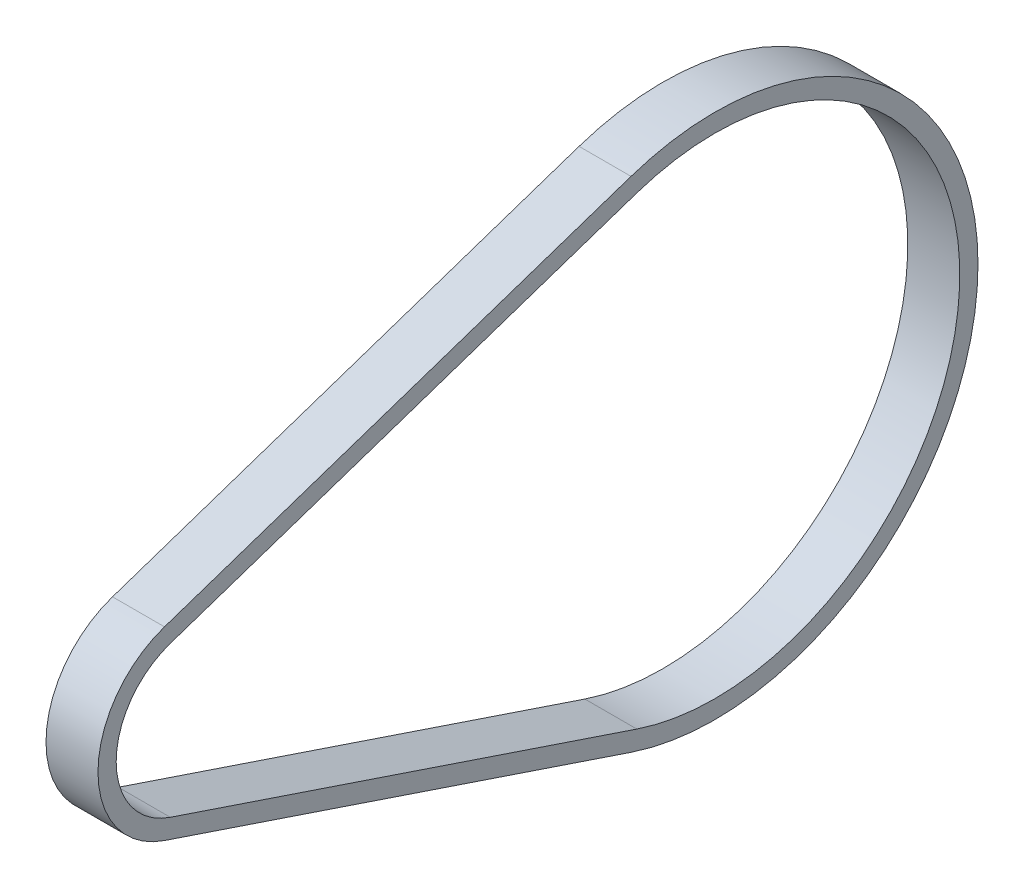
ISO-10303-21;
HEADER;
FILE_DESCRIPTION(('STEP AP214'),'2;1');
FILE_NAME('part.step','',(''),(''),'','','');
FILE_SCHEMA(('AUTOMOTIVE_DESIGN { 1 0 10303 214 1 1 1 1 }'));
ENDSEC;
DATA;
#1=APPLICATION_CONTEXT('core data for automotive mechanical design processes');
#2=APPLICATION_PROTOCOL_DEFINITION('international standard','automotive_design',2000,#1);
#3=PRODUCT_CONTEXT('',#1,'mechanical');
#4=PRODUCT('Part','Part','',(#3));
#5=PRODUCT_RELATED_PRODUCT_CATEGORY('part','',(#4));
#6=PRODUCT_DEFINITION_FORMATION('','',#4);
#7=PRODUCT_DEFINITION_CONTEXT('part definition',#1,'design');
#8=PRODUCT_DEFINITION('design','',#6,#7);
#9=PRODUCT_DEFINITION_SHAPE('','',#8);
#10=(LENGTH_UNIT() NAMED_UNIT(*) SI_UNIT(.MILLI.,.METRE.));
#11=(NAMED_UNIT(*) PLANE_ANGLE_UNIT() SI_UNIT($,.RADIAN.));
#12=(NAMED_UNIT(*) SI_UNIT($,.STERADIAN.) SOLID_ANGLE_UNIT());
#13=UNCERTAINTY_MEASURE_WITH_UNIT(LENGTH_MEASURE(1.E-05),#10,'distance_accuracy_value','');
#14=(GEOMETRIC_REPRESENTATION_CONTEXT(3) GLOBAL_UNCERTAINTY_ASSIGNED_CONTEXT((#13)) GLOBAL_UNIT_ASSIGNED_CONTEXT((#10,
#11,#12)) REPRESENTATION_CONTEXT('',''));
#15=CARTESIAN_POINT('',(0.,0.,0.));
#16=DIRECTION('',(0.,0.,1.));
#17=DIRECTION('',(1.,0.,0.));
#18=AXIS2_PLACEMENT_3D('',#15,#16,#17);
#19=CARTESIAN_POINT('',(6.021,39.066982169511,93.218905768999));
#20=DIRECTION('',(0.,-0.947862243379144,-0.318680353295048));
#21=DIRECTION('',(0.,0.318680353295048,-0.947862243379144));
#22=AXIS2_PLACEMENT_3D('',#19,#20,#21);
#23=PLANE('',#22);
#24=DIRECTION('',(1.,0.,0.));
#25=VECTOR('',#24,1.);
#26=CARTESIAN_POINT('',(6.021,57.1698175379885,39.3750024141588));
#27=LINE('',#26,#25);
#28=CARTESIAN_POINT('',(0.0209999999999844,57.1698175379887,39.3750024141591));
#29=VERTEX_POINT('',#28);
#30=CARTESIAN_POINT('',(6.021,57.1698175379887,39.3750024141591));
#31=VERTEX_POINT('',#30);
#32=EDGE_CURVE('E96',#29,#31,#27,.T.);
#33=ORIENTED_EDGE('',*,*,#32,.T.);
#34=DIRECTION('',(0.,-0.318680353294782,0.947862243379234));
#35=VECTOR('',#34,1.);
#36=CARTESIAN_POINT('',(6.021,57.169817537989,39.375002414159));
#37=LINE('',#36,#35);
#38=CARTESIAN_POINT('',(6.021,39.0669821695112,93.218905768999));
#39=VERTEX_POINT('',#38);
#40=EDGE_CURVE('E95',#31,#39,#37,.T.);
#41=ORIENTED_EDGE('',*,*,#40,.T.);
#42=DIRECTION('',(1.,0.,0.));
#43=VECTOR('',#42,1.);
#44=CARTESIAN_POINT('',(6.021,39.0669821695114,93.2189057689991));
#45=LINE('',#44,#43);
#46=CARTESIAN_POINT('',(0.0209999999999897,39.0669821695112,93.218905768999));
#47=VERTEX_POINT('',#46);
#48=EDGE_CURVE('E121',#39,#47,#45,.F.);
#49=ORIENTED_EDGE('',*,*,#48,.T.);
#50=DIRECTION('',(0.,-0.318680353294782,0.947862243379234));
#51=VECTOR('',#50,1.);
#52=CARTESIAN_POINT('',(0.020999999999987,57.169817537989,39.375002414159));
#53=LINE('',#52,#51);
#54=EDGE_CURVE('E132',#29,#47,#53,.T.);
#55=ORIENTED_EDGE('',*,*,#54,.F.);
#56=EDGE_LOOP('',(#33,#41,#49,#55));
#57=FACE_BOUND('',#56,.T.);
#58=ADVANCED_FACE('F15',(#57),#23,.T.);
#59=CARTESIAN_POINT('',(6.021,30.3767,90.297149774016));
#60=DIRECTION('',(1.,0.,0.));
#61=DIRECTION('',(0.,1.,0.));
#62=AXIS2_PLACEMENT_3D('',#59,#60,#61);
#63=CYLINDRICAL_SURFACE('',#62,9.168296585514);
#64=CARTESIAN_POINT('',(0.0209999999999906,30.3767,90.297149774016));
#65=DIRECTION('',(1.,0.,0.));
#66=DIRECTION('',(0.,1.,0.));
#67=AXIS2_PLACEMENT_3D('',#64,#65,#66);
#68=CIRCLE('',#67,9.168296585514);
#69=CARTESIAN_POINT('',(0.0209999999999916,21.6864178304965,93.2189057689964));
#70=VERTEX_POINT('',#69);
#71=EDGE_CURVE('E129',#47,#70,#68,.T.);
#72=ORIENTED_EDGE('',*,*,#71,.F.);
#73=ORIENTED_EDGE('',*,*,#48,.F.);
#74=CARTESIAN_POINT('',(6.021,30.3767,90.297149774016));
#75=DIRECTION('',(1.,0.,0.));
#76=DIRECTION('',(0.,1.,0.));
#77=AXIS2_PLACEMENT_3D('',#74,#75,#76);
#78=CIRCLE('',#77,9.168296585514);
#79=CARTESIAN_POINT('',(6.021,21.6864178304965,93.2189057689964));
#80=VERTEX_POINT('',#79);
#81=EDGE_CURVE('E108',#39,#80,#78,.T.);
#82=ORIENTED_EDGE('',*,*,#81,.T.);
#83=DIRECTION('',(1.,0.,0.));
#84=VECTOR('',#83,1.);
#85=CARTESIAN_POINT('',(6.021,21.6864178305042,93.2189057689939));
#86=LINE('',#85,#84);
#87=EDGE_CURVE('E117',#70,#80,#86,.T.);
#88=ORIENTED_EDGE('',*,*,#87,.F.);
#89=EDGE_LOOP('',(#72,#73,#82,#88));
#90=FACE_BOUND('',#89,.T.);
#91=ADVANCED_FACE('F139',(#90),#63,.F.);
#92=CARTESIAN_POINT('',(6.021,3.583582462011,39.375002414159));
#93=DIRECTION('',(0.,0.947862243379144,-0.318680353295048));
#94=DIRECTION('',(0.,0.318680353295048,0.947862243379144));
#95=AXIS2_PLACEMENT_3D('',#92,#93,#94);
#96=PLANE('',#95);
#97=ORIENTED_EDGE('',*,*,#87,.T.);
#98=DIRECTION('',(0.,-0.318680353294782,-0.947862243379234));
#99=VECTOR('',#98,1.);
#100=CARTESIAN_POINT('',(6.021,21.686417830489,93.218905768999));
#101=LINE('',#100,#99);
#102=CARTESIAN_POINT('',(6.02100000000001,3.58358246201129,39.3750024141591));
#103=VERTEX_POINT('',#102);
#104=EDGE_CURVE('E106',#80,#103,#101,.T.);
#105=ORIENTED_EDGE('',*,*,#104,.T.);
#106=DIRECTION('',(1.,0.,0.));
#107=VECTOR('',#106,1.);
#108=CARTESIAN_POINT('',(6.021,3.58358246201147,39.3750024141588));
#109=LINE('',#108,#107);
#110=CARTESIAN_POINT('',(0.02099999999999,3.58358246201129,39.3750024141591));
#111=VERTEX_POINT('',#110);
#112=EDGE_CURVE('E115',#103,#111,#109,.F.);
#113=ORIENTED_EDGE('',*,*,#112,.T.);
#114=DIRECTION('',(0.,-0.318680353294782,-0.947862243379234));
#115=VECTOR('',#114,1.);
#116=CARTESIAN_POINT('',(0.020999999999991,21.686417830489,93.218905768999));
#117=LINE('',#116,#115);
#118=EDGE_CURVE('E128',#70,#111,#117,.T.);
#119=ORIENTED_EDGE('',*,*,#118,.F.);
#120=EDGE_LOOP('',(#97,#105,#113,#119));
#121=FACE_BOUND('',#120,.T.);
#122=ADVANCED_FACE('F145',(#121),#96,.T.);
#123=CARTESIAN_POINT('',(6.021,30.3767,30.3669));
#124=DIRECTION('',(1.,0.,0.));
#125=DIRECTION('',(0.,1.,0.));
#126=AXIS2_PLACEMENT_3D('',#123,#124,#125);
#127=CYLINDRICAL_SURFACE('',#126,28.266889756541);
#128=CARTESIAN_POINT('',(0.0209999999999872,30.3767,30.3669));
#129=DIRECTION('',(1.,0.,0.));
#130=DIRECTION('',(0.,1.,0.));
#131=AXIS2_PLACEMENT_3D('',#128,#129,#130);
#132=CIRCLE('',#131,28.266889756541);
#133=EDGE_CURVE('E114',#111,#29,#132,.T.);
#134=ORIENTED_EDGE('',*,*,#133,.F.);
#135=ORIENTED_EDGE('',*,*,#112,.F.);
#136=CARTESIAN_POINT('',(6.021,30.3767,30.3669));
#137=DIRECTION('',(1.,0.,0.));
#138=DIRECTION('',(0.,1.,0.));
#139=AXIS2_PLACEMENT_3D('',#136,#137,#138);
#140=CIRCLE('',#139,28.266889756541);
#141=EDGE_CURVE('E87',#103,#31,#140,.T.);
#142=ORIENTED_EDGE('',*,*,#141,.T.);
#143=ORIENTED_EDGE('',*,*,#32,.F.);
#144=EDGE_LOOP('',(#134,#135,#142,#143));
#145=FACE_BOUND('',#144,.T.);
#146=ADVANCED_FACE('F152',(#145),#127,.F.);
#147=CARTESIAN_POINT('',(6.021,30.3767,90.297149774017));
#148=DIRECTION('',(1.,0.,0.));
#149=DIRECTION('',(0.,1.,0.));
#150=AXIS2_PLACEMENT_3D('',#147,#148,#149);
#151=CYLINDRICAL_SURFACE('',#150,11.268296585514);
#152=CARTESIAN_POINT('',(0.0209999999999906,30.3767,90.297149774017));
#153=DIRECTION('',(1.,0.,0.));
#154=DIRECTION('',(0.,1.,0.));
#155=AXIS2_PLACEMENT_3D('',#152,#153,#154);
#156=CIRCLE('',#155,11.268296585514);
#157=CARTESIAN_POINT('',(0.0209999999999917,19.6959071194002,93.8881345109157));
#158=VERTEX_POINT('',#157);
#159=CARTESIAN_POINT('',(0.0209999999999896,41.0574928806073,93.88813451092));
#160=VERTEX_POINT('',#159);
#161=EDGE_CURVE('E82',#158,#160,#156,.F.);
#162=ORIENTED_EDGE('',*,*,#161,.F.);
#163=DIRECTION('',(1.,0.,0.));
#164=VECTOR('',#163,1.);
#165=CARTESIAN_POINT('',(6.021,19.6959071194081,93.8881345109126));
#166=LINE('',#165,#164);
#167=CARTESIAN_POINT('',(6.021,19.6959071194087,93.8881345109146));
#168=VERTEX_POINT('',#167);
#169=EDGE_CURVE('E78',#158,#168,#166,.T.);
#170=ORIENTED_EDGE('',*,*,#169,.T.);
#171=CARTESIAN_POINT('',(6.021,30.3767,90.297149774017));
#172=DIRECTION('',(1.,0.,0.));
#173=DIRECTION('',(0.,1.,0.));
#174=AXIS2_PLACEMENT_3D('',#171,#172,#173);
#175=CIRCLE('',#174,11.268296585514);
#176=CARTESIAN_POINT('',(6.021,41.0574928806073,93.88813451092));
#177=VERTEX_POINT('',#176);
#178=EDGE_CURVE('E18',#168,#177,#175,.F.);
#179=ORIENTED_EDGE('',*,*,#178,.T.);
#180=DIRECTION('',(1.,0.,0.));
#181=VECTOR('',#180,1.);
#182=CARTESIAN_POINT('',(6.021,41.057492880608,93.888134510918));
#183=LINE('',#182,#181);
#184=EDGE_CURVE('E112',#177,#160,#183,.F.);
#185=ORIENTED_EDGE('',*,*,#184,.T.);
#186=EDGE_LOOP('',(#162,#170,#179,#185));
#187=FACE_BOUND('',#186,.T.);
#188=ADVANCED_FACE('F80',(#187),#151,.T.);
#189=CARTESIAN_POINT('',(6.021,30.3767,48.890431045835));
#190=DIRECTION('',(-1.,0.,0.));
#191=DIRECTION('',(0.,-1.,0.));
#192=AXIS2_PLACEMENT_3D('',#189,#190,#191);
#193=PLANE('',#192);
#194=ORIENTED_EDGE('',*,*,#104,.F.);
#195=ORIENTED_EDGE('',*,*,#81,.F.);
#196=ORIENTED_EDGE('',*,*,#40,.F.);
#197=ORIENTED_EDGE('',*,*,#141,.F.);
#198=EDGE_LOOP('',(#194,#195,#196,#197));
#199=FACE_BOUND('',#198,.T.);
#200=DIRECTION('',(0.,0.318680353295048,-0.947862243379144));
#201=VECTOR('',#200,1.);
#202=CARTESIAN_POINT('',(6.021,41.057492880608,93.888134510918));
#203=LINE('',#202,#201);
#204=CARTESIAN_POINT('',(6.021,59.1603282490916,40.0442311560848));
#205=VERTEX_POINT('',#204);
#206=EDGE_CURVE('E93',#205,#177,#203,.F.);
#207=ORIENTED_EDGE('',*,*,#206,.T.);
#208=ORIENTED_EDGE('',*,*,#178,.F.);
#209=DIRECTION('',(0.,0.318680353295048,0.947862243379144));
#210=VECTOR('',#209,1.);
#211=CARTESIAN_POINT('',(6.021,1.593071750915,40.044231156078));
#212=LINE('',#211,#210);
#213=CARTESIAN_POINT('',(6.021,1.59307175091642,40.0442311560821));
#214=VERTEX_POINT('',#213);
#215=EDGE_CURVE('E86',#168,#214,#212,.F.);
#216=ORIENTED_EDGE('',*,*,#215,.T.);
#217=CARTESIAN_POINT('',(6.021,30.3767,30.3669));
#218=DIRECTION('',(1.,0.,0.));
#219=DIRECTION('',(0.,1.,0.));
#220=AXIS2_PLACEMENT_3D('',#217,#218,#219);
#221=CIRCLE('',#220,30.366889756541);
#222=EDGE_CURVE('E111',#205,#214,#221,.F.);
#223=ORIENTED_EDGE('',*,*,#222,.F.);
#224=EDGE_LOOP('',(#207,#208,#216,#223));
#225=FACE_BOUND('',#224,.T.);
#226=ADVANCED_FACE('F90',(#199,#225),#193,.F.);
#227=CARTESIAN_POINT('',(6.021,1.593071750915,40.044231156078));
#228=DIRECTION('',(0.,0.947862243379144,-0.318680353295048));
#229=DIRECTION('',(0.,0.318680353295048,0.947862243379144));
#230=AXIS2_PLACEMENT_3D('',#227,#228,#229);
#231=PLANE('',#230);
#232=ORIENTED_EDGE('',*,*,#169,.F.);
#233=DIRECTION('',(0.,0.318680353294766,0.947862243379239));
#234=VECTOR('',#233,1.);
#235=CARTESIAN_POINT('',(0.0209999999999932,1.593071750915,40.044231156078));
#236=LINE('',#235,#234);
#237=CARTESIAN_POINT('',(0.0209999999999896,1.59307175091501,40.0442311560778));
#238=VERTEX_POINT('',#237);
#239=EDGE_CURVE('E101',#238,#158,#236,.T.);
#240=ORIENTED_EDGE('',*,*,#239,.F.);
#241=DIRECTION('',(1.,0.,0.));
#242=VECTOR('',#241,1.);
#243=CARTESIAN_POINT('',(6.021,1.59307175091511,40.044231156078));
#244=LINE('',#243,#242);
#245=EDGE_CURVE('E99',#214,#238,#244,.F.);
#246=ORIENTED_EDGE('',*,*,#245,.F.);
#247=ORIENTED_EDGE('',*,*,#215,.F.);
#248=EDGE_LOOP('',(#232,#240,#246,#247));
#249=FACE_BOUND('',#248,.T.);
#250=ADVANCED_FACE('F97',(#249),#231,.F.);
#251=CARTESIAN_POINT('',(0.02099999999999,30.3767,48.890431045835));
#252=DIRECTION('',(-1.,0.,0.));
#253=DIRECTION('',(0.,-1.,0.));
#254=AXIS2_PLACEMENT_3D('',#251,#252,#253);
#255=PLANE('',#254);
#256=ORIENTED_EDGE('',*,*,#118,.T.);
#257=ORIENTED_EDGE('',*,*,#133,.T.);
#258=ORIENTED_EDGE('',*,*,#54,.T.);
#259=ORIENTED_EDGE('',*,*,#71,.T.);
#260=EDGE_LOOP('',(#256,#257,#258,#259));
#261=FACE_BOUND('',#260,.T.);
#262=DIRECTION('',(0.,0.318680353295048,-0.947862243379144));
#263=VECTOR('',#262,1.);
#264=CARTESIAN_POINT('',(0.0209999999999898,41.057492880608,93.888134510918));
#265=LINE('',#264,#263);
#266=CARTESIAN_POINT('',(0.020999999999983,59.1603282490916,40.0442311560848));
#267=VERTEX_POINT('',#266);
#268=EDGE_CURVE('E33',#160,#267,#265,.T.);
#269=ORIENTED_EDGE('',*,*,#268,.T.);
#270=CARTESIAN_POINT('',(0.0209999999999863,30.3767,30.3669));
#271=DIRECTION('',(1.,0.,0.));
#272=DIRECTION('',(0.,1.,0.));
#273=AXIS2_PLACEMENT_3D('',#270,#271,#272);
#274=CIRCLE('',#273,30.366889756541);
#275=EDGE_CURVE('E24',#238,#267,#274,.T.);
#276=ORIENTED_EDGE('',*,*,#275,.F.);
#277=ORIENTED_EDGE('',*,*,#239,.T.);
#278=ORIENTED_EDGE('',*,*,#161,.T.);
#279=EDGE_LOOP('',(#269,#276,#277,#278));
#280=FACE_BOUND('',#279,.T.);
#281=ADVANCED_FACE('F155',(#261,#280),#255,.T.);
#282=CARTESIAN_POINT('',(6.021,41.057492880608,93.888134510918));
#283=DIRECTION('',(0.,-0.947862243379144,-0.318680353295048));
#284=DIRECTION('',(0.,0.318680353295048,-0.947862243379144));
#285=AXIS2_PLACEMENT_3D('',#282,#283,#284);
#286=PLANE('',#285);
#287=DIRECTION('',(1.,0.,0.));
#288=VECTOR('',#287,1.);
#289=CARTESIAN_POINT('',(6.021,59.1603282490849,40.044231156078));
#290=LINE('',#289,#288);
#291=EDGE_CURVE('E9',#267,#205,#290,.T.);
#292=ORIENTED_EDGE('',*,*,#291,.F.);
#293=ORIENTED_EDGE('',*,*,#268,.F.);
#294=ORIENTED_EDGE('',*,*,#184,.F.);
#295=ORIENTED_EDGE('',*,*,#206,.F.);
#296=EDGE_LOOP('',(#292,#293,#294,#295));
#297=FACE_BOUND('',#296,.T.);
#298=ADVANCED_FACE('F162',(#297),#286,.F.);
#299=CARTESIAN_POINT('',(6.021,30.3767,30.3669));
#300=DIRECTION('',(1.,0.,0.));
#301=DIRECTION('',(0.,1.,0.));
#302=AXIS2_PLACEMENT_3D('',#299,#300,#301);
#303=CYLINDRICAL_SURFACE('',#302,30.366889756541);
#304=ORIENTED_EDGE('',*,*,#275,.T.);
#305=ORIENTED_EDGE('',*,*,#291,.T.);
#306=ORIENTED_EDGE('',*,*,#222,.T.);
#307=ORIENTED_EDGE('',*,*,#245,.T.);
#308=EDGE_LOOP('',(#304,#305,#306,#307));
#309=FACE_BOUND('',#308,.T.);
#310=ADVANCED_FACE('F160',(#309),#303,.T.);
#311=CLOSED_SHELL('',(#58,#91,#122,#146,#188,#226,#250,#281,#298,#310));
#312=MANIFOLD_SOLID_BREP('B1',#311);
#313=ADVANCED_BREP_SHAPE_REPRESENTATION('',(#18,#312),#14);
#314=SHAPE_DEFINITION_REPRESENTATION(#9,#313);
ENDSEC;
END-ISO-10303-21;
